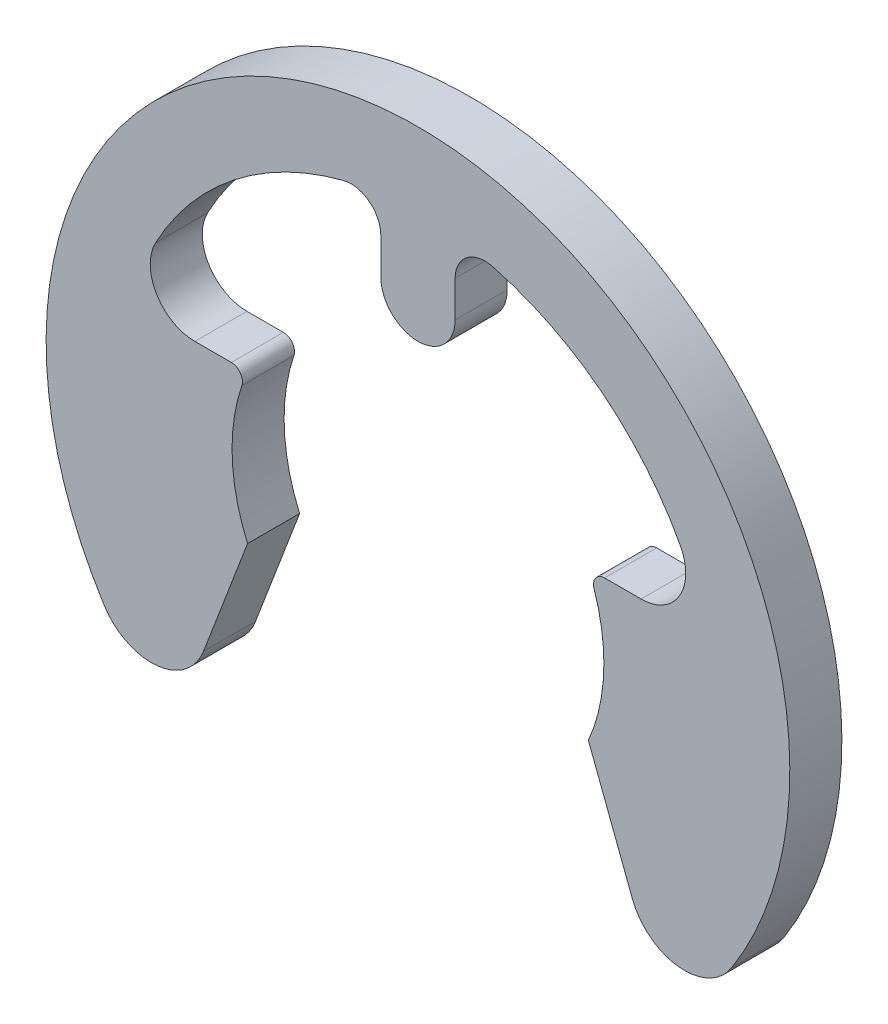
ISO-10303-21;
HEADER;
FILE_DESCRIPTION(('STEP AP214'),'2;1');
FILE_NAME('part.step','',(''),(''),'','','');
FILE_SCHEMA(('AUTOMOTIVE_DESIGN { 1 0 10303 214 1 1 1 1 }'));
ENDSEC;
DATA;
#1=APPLICATION_CONTEXT('core data for automotive mechanical design processes');
#2=APPLICATION_PROTOCOL_DEFINITION('international standard','automotive_design',2000,#1);
#3=PRODUCT_CONTEXT('',#1,'mechanical');
#4=PRODUCT('Part','Part','',(#3));
#5=PRODUCT_RELATED_PRODUCT_CATEGORY('part','',(#4));
#6=PRODUCT_DEFINITION_FORMATION('','',#4);
#7=PRODUCT_DEFINITION_CONTEXT('part definition',#1,'design');
#8=PRODUCT_DEFINITION('design','',#6,#7);
#9=PRODUCT_DEFINITION_SHAPE('','',#8);
#10=(LENGTH_UNIT() NAMED_UNIT(*) SI_UNIT(.MILLI.,.METRE.));
#11=(NAMED_UNIT(*) PLANE_ANGLE_UNIT() SI_UNIT($,.RADIAN.));
#12=(NAMED_UNIT(*) SI_UNIT($,.STERADIAN.) SOLID_ANGLE_UNIT());
#13=UNCERTAINTY_MEASURE_WITH_UNIT(LENGTH_MEASURE(1.E-05),#10,'distance_accuracy_value','');
#14=(GEOMETRIC_REPRESENTATION_CONTEXT(3) GLOBAL_UNCERTAINTY_ASSIGNED_CONTEXT((#13)) GLOBAL_UNIT_ASSIGNED_CONTEXT((#10,
#11,#12)) REPRESENTATION_CONTEXT('',''));
#15=CARTESIAN_POINT('',(0.,0.,0.));
#16=DIRECTION('',(0.,0.,1.));
#17=DIRECTION('',(1.,0.,0.));
#18=AXIS2_PLACEMENT_3D('',#15,#16,#17);
#19=CARTESIAN_POINT('',(0.,-1.62818111413352,0.7));
#20=DIRECTION('',(0.,0.,1.));
#21=DIRECTION('',(1.,0.,0.));
#22=AXIS2_PLACEMENT_3D('',#19,#20,#21);
#23=PLANE('',#22);
#24=DIRECTION('',(0.356753034006338,-0.934198732993828,0.));
#25=VECTOR('',#24,1.);
#26=CARTESIAN_POINT('',(2.88367381697336,-5.52758258755737,0.7));
#27=LINE('',#26,#25);
#28=CARTESIAN_POINT('',(2.88367381697336,-5.52758258755737,0.7));
#29=VERTEX_POINT('',#28);
#30=CARTESIAN_POINT('',(2.29128784747792,-3.976351989933,0.7));
#31=VERTEX_POINT('',#30);
#32=EDGE_CURVE('E177',#29,#31,#27,.F.);
#33=ORIENTED_EDGE('',*,*,#32,.F.);
#34=CARTESIAN_POINT('',(3.58432286671873,-5.26001781205261,0.7));
#35=DIRECTION('',(0.,0.,1.));
#36=DIRECTION('',(1.,0.,0.));
#37=AXIS2_PLACEMENT_3D('',#34,#35,#36);
#38=CIRCLE('',#37,0.75);
#39=CARTESIAN_POINT('',(4.2168504314338,-5.6630176630149,0.7));
#40=VERTEX_POINT('',#39);
#41=EDGE_CURVE('E242',#40,#29,#38,.F.);
#42=ORIENTED_EDGE('',*,*,#41,.F.);
#43=CARTESIAN_POINT('',(0.,-2.976351989933,0.7));
#44=DIRECTION('',(0.,0.,1.));
#45=DIRECTION('',(1.,0.,0.));
#46=AXIS2_PLACEMENT_3D('',#43,#44,#45);
#47=CIRCLE('',#46,5.);
#48=CARTESIAN_POINT('',(-4.2168504314338,-5.6630176630149,0.7));
#49=VERTEX_POINT('',#48);
#50=EDGE_CURVE('E165',#49,#40,#47,.F.);
#51=ORIENTED_EDGE('',*,*,#50,.F.);
#52=CARTESIAN_POINT('',(-3.58432286671873,-5.26001781205261,0.7));
#53=DIRECTION('',(0.,0.,1.));
#54=DIRECTION('',(1.,0.,0.));
#55=AXIS2_PLACEMENT_3D('',#52,#53,#54);
#56=CIRCLE('',#55,0.75);
#57=CARTESIAN_POINT('',(-2.88367381697336,-5.52758258755737,0.7));
#58=VERTEX_POINT('',#57);
#59=EDGE_CURVE('E20',#58,#49,#56,.F.);
#60=ORIENTED_EDGE('',*,*,#59,.F.);
#61=DIRECTION('',(0.356753034006338,0.934198732993828,0.));
#62=VECTOR('',#61,1.);
#63=CARTESIAN_POINT('',(-2.29128784747792,-3.976351989933,0.7));
#64=LINE('',#63,#62);
#65=CARTESIAN_POINT('',(-2.29128784747792,-3.976351989933,0.7));
#66=VERTEX_POINT('',#65);
#67=EDGE_CURVE('E149',#66,#58,#64,.F.);
#68=ORIENTED_EDGE('',*,*,#67,.F.);
#69=CARTESIAN_POINT('',(0.,-2.976351989933,0.7));
#70=DIRECTION('',(0.,0.,1.));
#71=DIRECTION('',(1.,0.,0.));
#72=AXIS2_PLACEMENT_3D('',#69,#70,#71);
#73=CIRCLE('',#72,2.5);
#74=CARTESIAN_POINT('',(-2.3679057354738,-2.17446519748017,0.7));
#75=VERTEX_POINT('',#74);
#76=EDGE_CURVE('E173',#66,#75,#73,.F.);
#77=ORIENTED_EDGE('',*,*,#76,.T.);
#78=CARTESIAN_POINT('',(-2.50998007960223,-2.126351989933,0.7));
#79=DIRECTION('',(0.,0.,1.));
#80=DIRECTION('',(1.,0.,0.));
#81=AXIS2_PLACEMENT_3D('',#78,#79,#80);
#82=CIRCLE('',#81,0.15);
#83=CARTESIAN_POINT('',(-2.50998007960223,-1.976351989933,0.7));
#84=VERTEX_POINT('',#83);
#85=EDGE_CURVE('E270',#84,#75,#82,.F.);
#86=ORIENTED_EDGE('',*,*,#85,.F.);
#87=DIRECTION('',(1.,0.,0.));
#88=VECTOR('',#87,1.);
#89=CARTESIAN_POINT('',(-3.,-1.976351989933,0.7));
#90=LINE('',#89,#88);
#91=CARTESIAN_POINT('',(-3.,-1.976351989933,0.7));
#92=VERTEX_POINT('',#91);
#93=EDGE_CURVE('E193',#92,#84,#90,.T.);
#94=ORIENTED_EDGE('',*,*,#93,.F.);
#95=CARTESIAN_POINT('',(-3.,-1.376351989933,0.7));
#96=DIRECTION('',(0.,0.,1.));
#97=DIRECTION('',(1.,0.,0.));
#98=AXIS2_PLACEMENT_3D('',#95,#96,#97);
#99=CIRCLE('',#98,0.6);
#100=CARTESIAN_POINT('',(-3.52941176470588,-1.09399904875653,0.7));
#101=VERTEX_POINT('',#100);
#102=EDGE_CURVE('E267',#92,#101,#99,.F.);
#103=ORIENTED_EDGE('',*,*,#102,.T.);
#104=CARTESIAN_POINT('',(0.,-2.976351989933,0.7));
#105=DIRECTION('',(0.,0.,1.));
#106=DIRECTION('',(1.,0.,0.));
#107=AXIS2_PLACEMENT_3D('',#104,#105,#106);
#108=CIRCLE('',#107,4.);
#109=CARTESIAN_POINT('',(-1.,0.896631356274416,0.7));
#110=VERTEX_POINT('',#109);
#111=EDGE_CURVE('E264',#101,#110,#108,.F.);
#112=ORIENTED_EDGE('',*,*,#111,.T.);
#113=CARTESIAN_POINT('',(-0.9,0.509333021653674,0.7));
#114=DIRECTION('',(0.,0.,1.));
#115=DIRECTION('',(1.,0.,0.));
#116=AXIS2_PLACEMENT_3D('',#113,#114,#115);
#117=CIRCLE('',#116,0.4);
#118=CARTESIAN_POINT('',(-0.5,0.509333021653674,0.7));
#119=VERTEX_POINT('',#118);
#120=EDGE_CURVE('E192',#110,#119,#117,.F.);
#121=ORIENTED_EDGE('',*,*,#120,.T.);
#122=DIRECTION('',(0.,1.,0.));
#123=VECTOR('',#122,1.);
#124=CARTESIAN_POINT('',(-0.5,0.023648010066999,0.7));
#125=LINE('',#124,#123);
#126=CARTESIAN_POINT('',(-0.5,0.023648010066999,0.7));
#127=VERTEX_POINT('',#126);
#128=EDGE_CURVE('E189',#127,#119,#125,.T.);
#129=ORIENTED_EDGE('',*,*,#128,.F.);
#130=CARTESIAN_POINT('',(0.,0.023648010066999,0.7));
#131=DIRECTION('',(0.,0.,1.));
#132=DIRECTION('',(1.,0.,0.));
#133=AXIS2_PLACEMENT_3D('',#130,#131,#132);
#134=CIRCLE('',#133,0.5);
#135=CARTESIAN_POINT('',(0.5,0.023648010066999,0.7));
#136=VERTEX_POINT('',#135);
#137=EDGE_CURVE('E259',#136,#127,#134,.F.);
#138=ORIENTED_EDGE('',*,*,#137,.F.);
#139=DIRECTION('',(0.,1.,0.));
#140=VECTOR('',#139,1.);
#141=CARTESIAN_POINT('',(0.5,0.509333021653674,0.7));
#142=LINE('',#141,#140);
#143=CARTESIAN_POINT('',(0.5,0.509333021653674,0.7));
#144=VERTEX_POINT('',#143);
#145=EDGE_CURVE('E185',#144,#136,#142,.F.);
#146=ORIENTED_EDGE('',*,*,#145,.F.);
#147=CARTESIAN_POINT('',(0.9,0.509333021653674,0.7));
#148=DIRECTION('',(0.,0.,1.));
#149=DIRECTION('',(1.,0.,0.));
#150=AXIS2_PLACEMENT_3D('',#147,#148,#149);
#151=CIRCLE('',#150,0.4);
#152=CARTESIAN_POINT('',(1.,0.896631356274416,0.7));
#153=VERTEX_POINT('',#152);
#154=EDGE_CURVE('E256',#144,#153,#151,.F.);
#155=ORIENTED_EDGE('',*,*,#154,.T.);
#156=CARTESIAN_POINT('',(0.,-2.976351989933,0.7));
#157=DIRECTION('',(0.,0.,1.));
#158=DIRECTION('',(1.,0.,0.));
#159=AXIS2_PLACEMENT_3D('',#156,#157,#158);
#160=CIRCLE('',#159,4.);
#161=CARTESIAN_POINT('',(3.52941176470588,-1.09399904875653,0.7));
#162=VERTEX_POINT('',#161);
#163=EDGE_CURVE('E253',#153,#162,#160,.F.);
#164=ORIENTED_EDGE('',*,*,#163,.T.);
#165=CARTESIAN_POINT('',(3.,-1.376351989933,0.7));
#166=DIRECTION('',(0.,0.,1.));
#167=DIRECTION('',(1.,0.,0.));
#168=AXIS2_PLACEMENT_3D('',#165,#166,#167);
#169=CIRCLE('',#168,0.6);
#170=CARTESIAN_POINT('',(3.,-1.976351989933,0.7));
#171=VERTEX_POINT('',#170);
#172=EDGE_CURVE('E184',#162,#171,#169,.F.);
#173=ORIENTED_EDGE('',*,*,#172,.T.);
#174=DIRECTION('',(1.,0.,0.));
#175=VECTOR('',#174,1.);
#176=CARTESIAN_POINT('',(2.50998007960223,-1.976351989933,0.7));
#177=LINE('',#176,#175);
#178=CARTESIAN_POINT('',(2.50998007960223,-1.976351989933,0.7));
#179=VERTEX_POINT('',#178);
#180=EDGE_CURVE('E181',#179,#171,#177,.T.);
#181=ORIENTED_EDGE('',*,*,#180,.F.);
#182=CARTESIAN_POINT('',(2.50998007960223,-2.126351989933,0.7));
#183=DIRECTION('',(0.,0.,1.));
#184=DIRECTION('',(1.,0.,0.));
#185=AXIS2_PLACEMENT_3D('',#182,#183,#184);
#186=CIRCLE('',#185,0.15);
#187=CARTESIAN_POINT('',(2.3679057354738,-2.17446519748017,0.7));
#188=VERTEX_POINT('',#187);
#189=EDGE_CURVE('E247',#188,#179,#186,.F.);
#190=ORIENTED_EDGE('',*,*,#189,.F.);
#191=CARTESIAN_POINT('',(0.,-2.976351989933,0.7));
#192=DIRECTION('',(0.,0.,1.));
#193=DIRECTION('',(1.,0.,0.));
#194=AXIS2_PLACEMENT_3D('',#191,#192,#193);
#195=CIRCLE('',#194,2.5);
#196=EDGE_CURVE('E180',#188,#31,#195,.F.);
#197=ORIENTED_EDGE('',*,*,#196,.T.);
#198=EDGE_LOOP('',(#33,#42,#51,#60,#68,#77,#86,#94,#103,#112,#121,#129,#138,#146,#155,#164,#173,
#181,#190,#197));
#199=FACE_BOUND('',#198,.T.);
#200=ADVANCED_FACE('F17',(#199),#23,.T.);
#201=CARTESIAN_POINT('',(-3.58432286671873,-5.26001781205261,0.));
#202=DIRECTION('',(0.,0.,1.));
#203=DIRECTION('',(1.,0.,0.));
#204=AXIS2_PLACEMENT_3D('',#201,#202,#203);
#205=CYLINDRICAL_SURFACE('',#204,0.75);
#206=CARTESIAN_POINT('',(-3.58432286671873,-5.26001781205261,0.));
#207=DIRECTION('',(0.,0.,1.));
#208=DIRECTION('',(1.,0.,0.));
#209=AXIS2_PLACEMENT_3D('',#206,#207,#208);
#210=CIRCLE('',#209,0.75);
#211=CARTESIAN_POINT('',(-4.2168504314338,-5.6630176630149,0.));
#212=VERTEX_POINT('',#211);
#213=CARTESIAN_POINT('',(-2.88367381697336,-5.52758258755737,0.));
#214=VERTEX_POINT('',#213);
#215=EDGE_CURVE('E171',#212,#214,#210,.T.);
#216=ORIENTED_EDGE('',*,*,#215,.T.);
#217=DIRECTION('',(0.,0.,1.));
#218=VECTOR('',#217,1.);
#219=CARTESIAN_POINT('',(-2.88367381697336,-5.52758258755737,0.));
#220=LINE('',#219,#218);
#221=EDGE_CURVE('E154',#58,#214,#220,.F.);
#222=ORIENTED_EDGE('',*,*,#221,.F.);
#223=ORIENTED_EDGE('',*,*,#59,.T.);
#224=DIRECTION('',(0.,0.,1.));
#225=VECTOR('',#224,1.);
#226=CARTESIAN_POINT('',(-4.2168504314338,-5.6630176630149,0.));
#227=LINE('',#226,#225);
#228=EDGE_CURVE('E239',#212,#49,#227,.T.);
#229=ORIENTED_EDGE('',*,*,#228,.F.);
#230=EDGE_LOOP('',(#216,#222,#223,#229));
#231=FACE_BOUND('',#230,.T.);
#232=ADVANCED_FACE('F170',(#231),#205,.T.);
#233=CARTESIAN_POINT('',(-2.29128784747792,-3.976351989933,0.));
#234=DIRECTION('',(0.934198732993828,-0.356753034006338,0.));
#235=DIRECTION('',(0.356753034006338,0.934198732993828,0.));
#236=AXIS2_PLACEMENT_3D('',#233,#234,#235);
#237=PLANE('',#236);
#238=DIRECTION('',(0.356753034006338,0.934198732993827,0.));
#239=VECTOR('',#238,1.);
#240=CARTESIAN_POINT('',(-2.88367381697336,-5.52758258755737,0.));
#241=LINE('',#240,#239);
#242=CARTESIAN_POINT('',(-2.29128784747792,-3.976351989933,0.));
#243=VERTEX_POINT('',#242);
#244=EDGE_CURVE('E237',#214,#243,#241,.T.);
#245=ORIENTED_EDGE('',*,*,#244,.T.);
#246=DIRECTION('',(0.,0.,1.));
#247=VECTOR('',#246,1.);
#248=CARTESIAN_POINT('',(-2.29128784747792,-3.976351989933,0.));
#249=LINE('',#248,#247);
#250=EDGE_CURVE('E156',#243,#66,#249,.T.);
#251=ORIENTED_EDGE('',*,*,#250,.T.);
#252=ORIENTED_EDGE('',*,*,#67,.T.);
#253=ORIENTED_EDGE('',*,*,#221,.T.);
#254=EDGE_LOOP('',(#245,#251,#252,#253));
#255=FACE_BOUND('',#254,.T.);
#256=ADVANCED_FACE('F152',(#255),#237,.T.);
#257=CARTESIAN_POINT('',(0.,-2.976351989933,0.));
#258=DIRECTION('',(0.,0.,1.));
#259=DIRECTION('',(1.,0.,0.));
#260=AXIS2_PLACEMENT_3D('',#257,#258,#259);
#261=CYLINDRICAL_SURFACE('',#260,2.5);
#262=ORIENTED_EDGE('',*,*,#250,.F.);
#263=CARTESIAN_POINT('',(0.,-2.976351989933,0.));
#264=DIRECTION('',(0.,0.,1.));
#265=DIRECTION('',(1.,0.,0.));
#266=AXIS2_PLACEMENT_3D('',#263,#264,#265);
#267=CIRCLE('',#266,2.5);
#268=CARTESIAN_POINT('',(-2.3679057354738,-2.17446519748017,0.));
#269=VERTEX_POINT('',#268);
#270=EDGE_CURVE('E234',#243,#269,#267,.F.);
#271=ORIENTED_EDGE('',*,*,#270,.T.);
#272=DIRECTION('',(0.,0.,1.));
#273=VECTOR('',#272,1.);
#274=CARTESIAN_POINT('',(-2.3679057354738,-2.17446519748017,0.));
#275=LINE('',#274,#273);
#276=EDGE_CURVE('E195',#75,#269,#275,.F.);
#277=ORIENTED_EDGE('',*,*,#276,.F.);
#278=ORIENTED_EDGE('',*,*,#76,.F.);
#279=EDGE_LOOP('',(#262,#271,#277,#278));
#280=FACE_BOUND('',#279,.T.);
#281=ADVANCED_FACE('F275',(#280),#261,.F.);
#282=CARTESIAN_POINT('',(-2.50998007960223,-2.126351989933,0.));
#283=DIRECTION('',(0.,0.,1.));
#284=DIRECTION('',(1.,0.,0.));
#285=AXIS2_PLACEMENT_3D('',#282,#283,#284);
#286=CYLINDRICAL_SURFACE('',#285,0.15);
#287=CARTESIAN_POINT('',(-2.50998007960223,-2.126351989933,0.));
#288=DIRECTION('',(0.,0.,1.));
#289=DIRECTION('',(1.,0.,0.));
#290=AXIS2_PLACEMENT_3D('',#287,#288,#289);
#291=CIRCLE('',#290,0.15);
#292=CARTESIAN_POINT('',(-2.50998007960223,-1.976351989933,0.));
#293=VERTEX_POINT('',#292);
#294=EDGE_CURVE('E231',#269,#293,#291,.T.);
#295=ORIENTED_EDGE('',*,*,#294,.T.);
#296=DIRECTION('',(0.,0.,1.));
#297=VECTOR('',#296,1.);
#298=CARTESIAN_POINT('',(-2.50998007960223,-1.976351989933,0.));
#299=LINE('',#298,#297);
#300=EDGE_CURVE('E194',#84,#293,#299,.F.);
#301=ORIENTED_EDGE('',*,*,#300,.F.);
#302=ORIENTED_EDGE('',*,*,#85,.T.);
#303=ORIENTED_EDGE('',*,*,#276,.T.);
#304=EDGE_LOOP('',(#295,#301,#302,#303));
#305=FACE_BOUND('',#304,.T.);
#306=ADVANCED_FACE('F376',(#305),#286,.T.);
#307=CARTESIAN_POINT('',(-3.,-1.976351989933,0.));
#308=DIRECTION('',(0.,1.,0.));
#309=DIRECTION('',(0.,0.,1.));
#310=AXIS2_PLACEMENT_3D('',#307,#308,#309);
#311=PLANE('',#310);
#312=DIRECTION('',(1.,0.,0.));
#313=VECTOR('',#312,1.);
#314=CARTESIAN_POINT('',(0.,-1.976351989933,0.));
#315=LINE('',#314,#313);
#316=CARTESIAN_POINT('',(-3.,-1.976351989933,0.));
#317=VERTEX_POINT('',#316);
#318=EDGE_CURVE('E230',#293,#317,#315,.F.);
#319=ORIENTED_EDGE('',*,*,#318,.T.);
#320=DIRECTION('',(0.,0.,1.));
#321=VECTOR('',#320,1.);
#322=CARTESIAN_POINT('',(-3.,-1.976351989933,0.));
#323=LINE('',#322,#321);
#324=EDGE_CURVE('E269',#317,#92,#323,.T.);
#325=ORIENTED_EDGE('',*,*,#324,.T.);
#326=ORIENTED_EDGE('',*,*,#93,.T.);
#327=ORIENTED_EDGE('',*,*,#300,.T.);
#328=EDGE_LOOP('',(#319,#325,#326,#327));
#329=FACE_BOUND('',#328,.T.);
#330=ADVANCED_FACE('F375',(#329),#311,.T.);
#331=CARTESIAN_POINT('',(-3.,-1.376351989933,0.));
#332=DIRECTION('',(0.,0.,1.));
#333=DIRECTION('',(1.,0.,0.));
#334=AXIS2_PLACEMENT_3D('',#331,#332,#333);
#335=CYLINDRICAL_SURFACE('',#334,0.6);
#336=ORIENTED_EDGE('',*,*,#324,.F.);
#337=CARTESIAN_POINT('',(-3.,-1.376351989933,0.));
#338=DIRECTION('',(0.,0.,1.));
#339=DIRECTION('',(1.,0.,0.));
#340=AXIS2_PLACEMENT_3D('',#337,#338,#339);
#341=CIRCLE('',#340,0.6);
#342=CARTESIAN_POINT('',(-3.52941176470588,-1.09399904875653,0.));
#343=VERTEX_POINT('',#342);
#344=EDGE_CURVE('E227',#317,#343,#341,.F.);
#345=ORIENTED_EDGE('',*,*,#344,.T.);
#346=DIRECTION('',(0.,0.,1.));
#347=VECTOR('',#346,1.);
#348=CARTESIAN_POINT('',(-3.52941176470588,-1.09399904875653,0.));
#349=LINE('',#348,#347);
#350=EDGE_CURVE('E266',#343,#101,#349,.T.);
#351=ORIENTED_EDGE('',*,*,#350,.T.);
#352=ORIENTED_EDGE('',*,*,#102,.F.);
#353=EDGE_LOOP('',(#336,#345,#351,#352));
#354=FACE_BOUND('',#353,.T.);
#355=ADVANCED_FACE('F372',(#354),#335,.F.);
#356=CARTESIAN_POINT('',(0.,-2.976351989933,0.));
#357=DIRECTION('',(0.,0.,1.));
#358=DIRECTION('',(1.,0.,0.));
#359=AXIS2_PLACEMENT_3D('',#356,#357,#358);
#360=CYLINDRICAL_SURFACE('',#359,4.);
#361=ORIENTED_EDGE('',*,*,#350,.F.);
#362=CARTESIAN_POINT('',(0.,-2.976351989933,0.));
#363=DIRECTION('',(0.,0.,1.));
#364=DIRECTION('',(1.,0.,0.));
#365=AXIS2_PLACEMENT_3D('',#362,#363,#364);
#366=CIRCLE('',#365,4.);
#367=CARTESIAN_POINT('',(-1.,0.896631356274416,0.));
#368=VERTEX_POINT('',#367);
#369=EDGE_CURVE('E224',#343,#368,#366,.F.);
#370=ORIENTED_EDGE('',*,*,#369,.T.);
#371=DIRECTION('',(0.,0.,1.));
#372=VECTOR('',#371,1.);
#373=CARTESIAN_POINT('',(-1.,0.896631356274416,0.));
#374=LINE('',#373,#372);
#375=EDGE_CURVE('E263',#368,#110,#374,.T.);
#376=ORIENTED_EDGE('',*,*,#375,.T.);
#377=ORIENTED_EDGE('',*,*,#111,.F.);
#378=EDGE_LOOP('',(#361,#370,#376,#377));
#379=FACE_BOUND('',#378,.T.);
#380=ADVANCED_FACE('F368',(#379),#360,.F.);
#381=CARTESIAN_POINT('',(-0.9,0.509333021653674,0.));
#382=DIRECTION('',(0.,0.,1.));
#383=DIRECTION('',(1.,0.,0.));
#384=AXIS2_PLACEMENT_3D('',#381,#382,#383);
#385=CYLINDRICAL_SURFACE('',#384,0.4);
#386=ORIENTED_EDGE('',*,*,#375,.F.);
#387=CARTESIAN_POINT('',(-0.9,0.509333021653674,0.));
#388=DIRECTION('',(0.,0.,1.));
#389=DIRECTION('',(1.,0.,0.));
#390=AXIS2_PLACEMENT_3D('',#387,#388,#389);
#391=CIRCLE('',#390,0.4);
#392=CARTESIAN_POINT('',(-0.5,0.509333021653674,0.));
#393=VERTEX_POINT('',#392);
#394=EDGE_CURVE('E221',#368,#393,#391,.F.);
#395=ORIENTED_EDGE('',*,*,#394,.T.);
#396=DIRECTION('',(0.,0.,1.));
#397=VECTOR('',#396,1.);
#398=CARTESIAN_POINT('',(-0.5,0.509333021653674,0.));
#399=LINE('',#398,#397);
#400=EDGE_CURVE('E191',#119,#393,#399,.F.);
#401=ORIENTED_EDGE('',*,*,#400,.F.);
#402=ORIENTED_EDGE('',*,*,#120,.F.);
#403=EDGE_LOOP('',(#386,#395,#401,#402));
#404=FACE_BOUND('',#403,.T.);
#405=ADVANCED_FACE('F364',(#404),#385,.F.);
#406=CARTESIAN_POINT('',(-0.5,0.023648010066999,0.));
#407=DIRECTION('',(-1.,0.,0.));
#408=DIRECTION('',(0.,0.,1.));
#409=AXIS2_PLACEMENT_3D('',#406,#407,#408);
#410=PLANE('',#409);
#411=DIRECTION('',(0.,1.,0.));
#412=VECTOR('',#411,1.);
#413=CARTESIAN_POINT('',(-0.5,-1.62818111413352,0.));
#414=LINE('',#413,#412);
#415=CARTESIAN_POINT('',(-0.5,0.023648010066999,0.));
#416=VERTEX_POINT('',#415);
#417=EDGE_CURVE('E220',#393,#416,#414,.F.);
#418=ORIENTED_EDGE('',*,*,#417,.T.);
#419=DIRECTION('',(0.,0.,1.));
#420=VECTOR('',#419,1.);
#421=CARTESIAN_POINT('',(-0.5,0.0236480100669991,0.));
#422=LINE('',#421,#420);
#423=EDGE_CURVE('E188',#127,#416,#422,.F.);
#424=ORIENTED_EDGE('',*,*,#423,.F.);
#425=ORIENTED_EDGE('',*,*,#128,.T.);
#426=ORIENTED_EDGE('',*,*,#400,.T.);
#427=EDGE_LOOP('',(#418,#424,#425,#426));
#428=FACE_BOUND('',#427,.T.);
#429=ADVANCED_FACE('F360',(#428),#410,.T.);
#430=CARTESIAN_POINT('',(0.,0.023648010066999,0.));
#431=DIRECTION('',(0.,0.,1.));
#432=DIRECTION('',(1.,0.,0.));
#433=AXIS2_PLACEMENT_3D('',#430,#431,#432);
#434=CYLINDRICAL_SURFACE('',#433,0.5);
#435=CARTESIAN_POINT('',(0.,0.023648010066999,0.));
#436=DIRECTION('',(0.,0.,1.));
#437=DIRECTION('',(1.,0.,0.));
#438=AXIS2_PLACEMENT_3D('',#435,#436,#437);
#439=CIRCLE('',#438,0.5);
#440=CARTESIAN_POINT('',(0.5,0.023648010066999,0.));
#441=VERTEX_POINT('',#440);
#442=EDGE_CURVE('E217',#416,#441,#439,.T.);
#443=ORIENTED_EDGE('',*,*,#442,.T.);
#444=DIRECTION('',(0.,0.,-1.));
#445=VECTOR('',#444,1.);
#446=CARTESIAN_POINT('',(0.5,0.023648010066999,0.));
#447=LINE('',#446,#445);
#448=EDGE_CURVE('E187',#136,#441,#447,.T.);
#449=ORIENTED_EDGE('',*,*,#448,.F.);
#450=ORIENTED_EDGE('',*,*,#137,.T.);
#451=ORIENTED_EDGE('',*,*,#423,.T.);
#452=EDGE_LOOP('',(#443,#449,#450,#451));
#453=FACE_BOUND('',#452,.T.);
#454=ADVANCED_FACE('F354',(#453),#434,.T.);
#455=CARTESIAN_POINT('',(0.5,0.509333021653674,0.));
#456=DIRECTION('',(1.,0.,0.));
#457=DIRECTION('',(0.,0.,-1.));
#458=AXIS2_PLACEMENT_3D('',#455,#456,#457);
#459=PLANE('',#458);
#460=DIRECTION('',(0.,1.,0.));
#461=VECTOR('',#460,1.);
#462=CARTESIAN_POINT('',(0.5,-1.62818111413352,0.));
#463=LINE('',#462,#461);
#464=CARTESIAN_POINT('',(0.5,0.509333021653674,0.));
#465=VERTEX_POINT('',#464);
#466=EDGE_CURVE('E216',#441,#465,#463,.T.);
#467=ORIENTED_EDGE('',*,*,#466,.T.);
#468=DIRECTION('',(0.,0.,1.));
#469=VECTOR('',#468,1.);
#470=CARTESIAN_POINT('',(0.5,0.509333021653674,0.));
#471=LINE('',#470,#469);
#472=EDGE_CURVE('E258',#465,#144,#471,.T.);
#473=ORIENTED_EDGE('',*,*,#472,.T.);
#474=ORIENTED_EDGE('',*,*,#145,.T.);
#475=ORIENTED_EDGE('',*,*,#448,.T.);
#476=EDGE_LOOP('',(#467,#473,#474,#475));
#477=FACE_BOUND('',#476,.T.);
#478=ADVANCED_FACE('F350',(#477),#459,.T.);
#479=CARTESIAN_POINT('',(0.9,0.509333021653674,0.));
#480=DIRECTION('',(0.,0.,1.));
#481=DIRECTION('',(1.,0.,0.));
#482=AXIS2_PLACEMENT_3D('',#479,#480,#481);
#483=CYLINDRICAL_SURFACE('',#482,0.4);
#484=ORIENTED_EDGE('',*,*,#472,.F.);
#485=CARTESIAN_POINT('',(0.9,0.509333021653674,0.));
#486=DIRECTION('',(0.,0.,1.));
#487=DIRECTION('',(1.,0.,0.));
#488=AXIS2_PLACEMENT_3D('',#485,#486,#487);
#489=CIRCLE('',#488,0.4);
#490=CARTESIAN_POINT('',(1.,0.896631356274415,0.));
#491=VERTEX_POINT('',#490);
#492=EDGE_CURVE('E213',#465,#491,#489,.F.);
#493=ORIENTED_EDGE('',*,*,#492,.T.);
#494=DIRECTION('',(0.,0.,1.));
#495=VECTOR('',#494,1.);
#496=CARTESIAN_POINT('',(1.,0.896631356274415,0.));
#497=LINE('',#496,#495);
#498=EDGE_CURVE('E255',#491,#153,#497,.T.);
#499=ORIENTED_EDGE('',*,*,#498,.T.);
#500=ORIENTED_EDGE('',*,*,#154,.F.);
#501=EDGE_LOOP('',(#484,#493,#499,#500));
#502=FACE_BOUND('',#501,.T.);
#503=ADVANCED_FACE('F346',(#502),#483,.F.);
#504=CARTESIAN_POINT('',(0.,-2.976351989933,0.));
#505=DIRECTION('',(0.,0.,1.));
#506=DIRECTION('',(1.,0.,0.));
#507=AXIS2_PLACEMENT_3D('',#504,#505,#506);
#508=CYLINDRICAL_SURFACE('',#507,4.);
#509=ORIENTED_EDGE('',*,*,#498,.F.);
#510=CARTESIAN_POINT('',(0.,-2.976351989933,0.));
#511=DIRECTION('',(0.,0.,1.));
#512=DIRECTION('',(1.,0.,0.));
#513=AXIS2_PLACEMENT_3D('',#510,#511,#512);
#514=CIRCLE('',#513,4.);
#515=CARTESIAN_POINT('',(3.52941176470588,-1.09399904875653,0.));
#516=VERTEX_POINT('',#515);
#517=EDGE_CURVE('E210',#491,#516,#514,.F.);
#518=ORIENTED_EDGE('',*,*,#517,.T.);
#519=DIRECTION('',(0.,0.,1.));
#520=VECTOR('',#519,1.);
#521=CARTESIAN_POINT('',(3.52941176470588,-1.09399904875653,0.));
#522=LINE('',#521,#520);
#523=EDGE_CURVE('E252',#516,#162,#522,.T.);
#524=ORIENTED_EDGE('',*,*,#523,.T.);
#525=ORIENTED_EDGE('',*,*,#163,.F.);
#526=EDGE_LOOP('',(#509,#518,#524,#525));
#527=FACE_BOUND('',#526,.T.);
#528=ADVANCED_FACE('F342',(#527),#508,.F.);
#529=CARTESIAN_POINT('',(3.,-1.376351989933,0.));
#530=DIRECTION('',(0.,0.,1.));
#531=DIRECTION('',(1.,0.,0.));
#532=AXIS2_PLACEMENT_3D('',#529,#530,#531);
#533=CYLINDRICAL_SURFACE('',#532,0.6);
#534=ORIENTED_EDGE('',*,*,#523,.F.);
#535=CARTESIAN_POINT('',(3.,-1.376351989933,0.));
#536=DIRECTION('',(0.,0.,1.));
#537=DIRECTION('',(1.,0.,0.));
#538=AXIS2_PLACEMENT_3D('',#535,#536,#537);
#539=CIRCLE('',#538,0.6);
#540=CARTESIAN_POINT('',(3.,-1.976351989933,0.));
#541=VERTEX_POINT('',#540);
#542=EDGE_CURVE('E207',#516,#541,#539,.F.);
#543=ORIENTED_EDGE('',*,*,#542,.T.);
#544=DIRECTION('',(0.,0.,1.));
#545=VECTOR('',#544,1.);
#546=CARTESIAN_POINT('',(3.,-1.976351989933,0.));
#547=LINE('',#546,#545);
#548=EDGE_CURVE('E183',#171,#541,#547,.F.);
#549=ORIENTED_EDGE('',*,*,#548,.F.);
#550=ORIENTED_EDGE('',*,*,#172,.F.);
#551=EDGE_LOOP('',(#534,#543,#549,#550));
#552=FACE_BOUND('',#551,.T.);
#553=ADVANCED_FACE('F338',(#552),#533,.F.);
#554=CARTESIAN_POINT('',(2.50998007960223,-1.976351989933,0.));
#555=DIRECTION('',(0.,1.,0.));
#556=DIRECTION('',(0.,0.,1.));
#557=AXIS2_PLACEMENT_3D('',#554,#555,#556);
#558=PLANE('',#557);
#559=DIRECTION('',(1.,0.,0.));
#560=VECTOR('',#559,1.);
#561=CARTESIAN_POINT('',(0.,-1.976351989933,0.));
#562=LINE('',#561,#560);
#563=CARTESIAN_POINT('',(2.50998007960223,-1.976351989933,0.));
#564=VERTEX_POINT('',#563);
#565=EDGE_CURVE('E206',#541,#564,#562,.F.);
#566=ORIENTED_EDGE('',*,*,#565,.T.);
#567=DIRECTION('',(0.,0.,1.));
#568=VECTOR('',#567,1.);
#569=CARTESIAN_POINT('',(2.50998007960223,-1.976351989933,0.));
#570=LINE('',#569,#568);
#571=EDGE_CURVE('E249',#179,#564,#570,.F.);
#572=ORIENTED_EDGE('',*,*,#571,.F.);
#573=ORIENTED_EDGE('',*,*,#180,.T.);
#574=ORIENTED_EDGE('',*,*,#548,.T.);
#575=EDGE_LOOP('',(#566,#572,#573,#574));
#576=FACE_BOUND('',#575,.T.);
#577=ADVANCED_FACE('F334',(#576),#558,.T.);
#578=CARTESIAN_POINT('',(2.50998007960223,-2.126351989933,0.));
#579=DIRECTION('',(0.,0.,1.));
#580=DIRECTION('',(1.,0.,0.));
#581=AXIS2_PLACEMENT_3D('',#578,#579,#580);
#582=CYLINDRICAL_SURFACE('',#581,0.15);
#583=CARTESIAN_POINT('',(2.50998007960223,-2.126351989933,0.));
#584=DIRECTION('',(0.,0.,1.));
#585=DIRECTION('',(1.,0.,0.));
#586=AXIS2_PLACEMENT_3D('',#583,#584,#585);
#587=CIRCLE('',#586,0.15);
#588=CARTESIAN_POINT('',(2.3679057354738,-2.17446519748017,0.));
#589=VERTEX_POINT('',#588);
#590=EDGE_CURVE('E203',#564,#589,#587,.T.);
#591=ORIENTED_EDGE('',*,*,#590,.T.);
#592=DIRECTION('',(0.,0.,1.));
#593=VECTOR('',#592,1.);
#594=CARTESIAN_POINT('',(2.3679057354738,-2.17446519748017,0.));
#595=LINE('',#594,#593);
#596=EDGE_CURVE('E246',#589,#188,#595,.T.);
#597=ORIENTED_EDGE('',*,*,#596,.T.);
#598=ORIENTED_EDGE('',*,*,#189,.T.);
#599=ORIENTED_EDGE('',*,*,#571,.T.);
#600=EDGE_LOOP('',(#591,#597,#598,#599));
#601=FACE_BOUND('',#600,.T.);
#602=ADVANCED_FACE('F328',(#601),#582,.T.);
#603=CARTESIAN_POINT('',(0.,-2.976351989933,0.));
#604=DIRECTION('',(0.,0.,1.));
#605=DIRECTION('',(1.,0.,0.));
#606=AXIS2_PLACEMENT_3D('',#603,#604,#605);
#607=CYLINDRICAL_SURFACE('',#606,2.5);
#608=ORIENTED_EDGE('',*,*,#596,.F.);
#609=CARTESIAN_POINT('',(0.,-2.976351989933,0.));
#610=DIRECTION('',(0.,0.,1.));
#611=DIRECTION('',(1.,0.,0.));
#612=AXIS2_PLACEMENT_3D('',#609,#610,#611);
#613=CIRCLE('',#612,2.5);
#614=CARTESIAN_POINT('',(2.29128784747792,-3.976351989933,0.));
#615=VERTEX_POINT('',#614);
#616=EDGE_CURVE('E200',#589,#615,#613,.F.);
#617=ORIENTED_EDGE('',*,*,#616,.T.);
#618=DIRECTION('',(0.,0.,1.));
#619=VECTOR('',#618,1.);
#620=CARTESIAN_POINT('',(2.29128784747792,-3.976351989933,0.));
#621=LINE('',#620,#619);
#622=EDGE_CURVE('E179',#31,#615,#621,.F.);
#623=ORIENTED_EDGE('',*,*,#622,.F.);
#624=ORIENTED_EDGE('',*,*,#196,.F.);
#625=EDGE_LOOP('',(#608,#617,#623,#624));
#626=FACE_BOUND('',#625,.T.);
#627=ADVANCED_FACE('F325',(#626),#607,.F.);
#628=CARTESIAN_POINT('',(2.88367381697336,-5.52758258755737,0.));
#629=DIRECTION('',(-0.934198732993828,-0.356753034006338,0.));
#630=DIRECTION('',(0.356753034006338,-0.934198732993828,0.));
#631=AXIS2_PLACEMENT_3D('',#628,#629,#630);
#632=PLANE('',#631);
#633=DIRECTION('',(0.356753034006338,-0.934198732993827,0.));
#634=VECTOR('',#633,1.);
#635=CARTESIAN_POINT('',(2.29128784747792,-3.976351989933,0.));
#636=LINE('',#635,#634);
#637=CARTESIAN_POINT('',(2.88367381697336,-5.52758258755737,0.));
#638=VERTEX_POINT('',#637);
#639=EDGE_CURVE('E199',#615,#638,#636,.T.);
#640=ORIENTED_EDGE('',*,*,#639,.T.);
#641=DIRECTION('',(0.,0.,1.));
#642=VECTOR('',#641,1.);
#643=CARTESIAN_POINT('',(2.88367381697336,-5.52758258755737,0.));
#644=LINE('',#643,#642);
#645=EDGE_CURVE('E241',#29,#638,#644,.F.);
#646=ORIENTED_EDGE('',*,*,#645,.F.);
#647=ORIENTED_EDGE('',*,*,#32,.T.);
#648=ORIENTED_EDGE('',*,*,#622,.T.);
#649=EDGE_LOOP('',(#640,#646,#647,#648));
#650=FACE_BOUND('',#649,.T.);
#651=ADVANCED_FACE('F317',(#650),#632,.T.);
#652=CARTESIAN_POINT('',(3.58432286671873,-5.26001781205261,0.));
#653=DIRECTION('',(0.,0.,1.));
#654=DIRECTION('',(1.,0.,0.));
#655=AXIS2_PLACEMENT_3D('',#652,#653,#654);
#656=CYLINDRICAL_SURFACE('',#655,0.75);
#657=CARTESIAN_POINT('',(3.58432286671873,-5.26001781205261,0.));
#658=DIRECTION('',(0.,0.,1.));
#659=DIRECTION('',(1.,0.,0.));
#660=AXIS2_PLACEMENT_3D('',#657,#658,#659);
#661=CIRCLE('',#660,0.75);
#662=CARTESIAN_POINT('',(4.2168504314338,-5.6630176630149,0.));
#663=VERTEX_POINT('',#662);
#664=EDGE_CURVE('E26',#638,#663,#661,.T.);
#665=ORIENTED_EDGE('',*,*,#664,.T.);
#666=DIRECTION('',(0.,0.,1.));
#667=VECTOR('',#666,1.);
#668=CARTESIAN_POINT('',(4.2168504314338,-5.6630176630149,0.));
#669=LINE('',#668,#667);
#670=EDGE_CURVE('E34',#40,#663,#669,.F.);
#671=ORIENTED_EDGE('',*,*,#670,.F.);
#672=ORIENTED_EDGE('',*,*,#41,.T.);
#673=ORIENTED_EDGE('',*,*,#645,.T.);
#674=EDGE_LOOP('',(#665,#671,#672,#673));
#675=FACE_BOUND('',#674,.T.);
#676=ADVANCED_FACE('F379',(#675),#656,.T.);
#677=CARTESIAN_POINT('',(0.,-2.976351989933,0.));
#678=DIRECTION('',(0.,0.,1.));
#679=DIRECTION('',(1.,0.,0.));
#680=AXIS2_PLACEMENT_3D('',#677,#678,#679);
#681=CYLINDRICAL_SURFACE('',#680,5.);
#682=CARTESIAN_POINT('',(0.,-2.976351989933,0.));
#683=DIRECTION('',(0.,0.,1.));
#684=DIRECTION('',(1.,0.,0.));
#685=AXIS2_PLACEMENT_3D('',#682,#683,#684);
#686=CIRCLE('',#685,5.);
#687=EDGE_CURVE('E11',#663,#212,#686,.T.);
#688=ORIENTED_EDGE('',*,*,#687,.T.);
#689=ORIENTED_EDGE('',*,*,#228,.T.);
#690=ORIENTED_EDGE('',*,*,#50,.T.);
#691=ORIENTED_EDGE('',*,*,#670,.T.);
#692=EDGE_LOOP('',(#688,#689,#690,#691));
#693=FACE_BOUND('',#692,.T.);
#694=ADVANCED_FACE('F377',(#693),#681,.T.);
#695=CARTESIAN_POINT('',(0.,-1.62818111413352,0.));
#696=DIRECTION('',(0.,0.,1.));
#697=DIRECTION('',(1.,0.,0.));
#698=AXIS2_PLACEMENT_3D('',#695,#696,#697);
#699=PLANE('',#698);
#700=ORIENTED_EDGE('',*,*,#664,.F.);
#701=ORIENTED_EDGE('',*,*,#639,.F.);
#702=ORIENTED_EDGE('',*,*,#616,.F.);
#703=ORIENTED_EDGE('',*,*,#590,.F.);
#704=ORIENTED_EDGE('',*,*,#565,.F.);
#705=ORIENTED_EDGE('',*,*,#542,.F.);
#706=ORIENTED_EDGE('',*,*,#517,.F.);
#707=ORIENTED_EDGE('',*,*,#492,.F.);
#708=ORIENTED_EDGE('',*,*,#466,.F.);
#709=ORIENTED_EDGE('',*,*,#442,.F.);
#710=ORIENTED_EDGE('',*,*,#417,.F.);
#711=ORIENTED_EDGE('',*,*,#394,.F.);
#712=ORIENTED_EDGE('',*,*,#369,.F.);
#713=ORIENTED_EDGE('',*,*,#344,.F.);
#714=ORIENTED_EDGE('',*,*,#318,.F.);
#715=ORIENTED_EDGE('',*,*,#294,.F.);
#716=ORIENTED_EDGE('',*,*,#270,.F.);
#717=ORIENTED_EDGE('',*,*,#244,.F.);
#718=ORIENTED_EDGE('',*,*,#215,.F.);
#719=ORIENTED_EDGE('',*,*,#687,.F.);
#720=EDGE_LOOP('',(#700,#701,#702,#703,#704,#705,#706,#707,#708,#709,#710,#711,#712,#713,#714,
#715,#716,#717,#718,#719));
#721=FACE_BOUND('',#720,.T.);
#722=ADVANCED_FACE('F322',(#721),#699,.F.);
#723=CLOSED_SHELL('',(#200,#232,#256,#281,#306,#330,#355,#380,#405,#429,#454,#478,#503,#528,
#553,#577,#602,#627,#651,#676,#694,#722));
#724=MANIFOLD_SOLID_BREP('B1',#723);
#725=ADVANCED_BREP_SHAPE_REPRESENTATION('',(#18,#724),#14);
#726=SHAPE_DEFINITION_REPRESENTATION(#9,#725);
ENDSEC;
END-ISO-10303-21;
